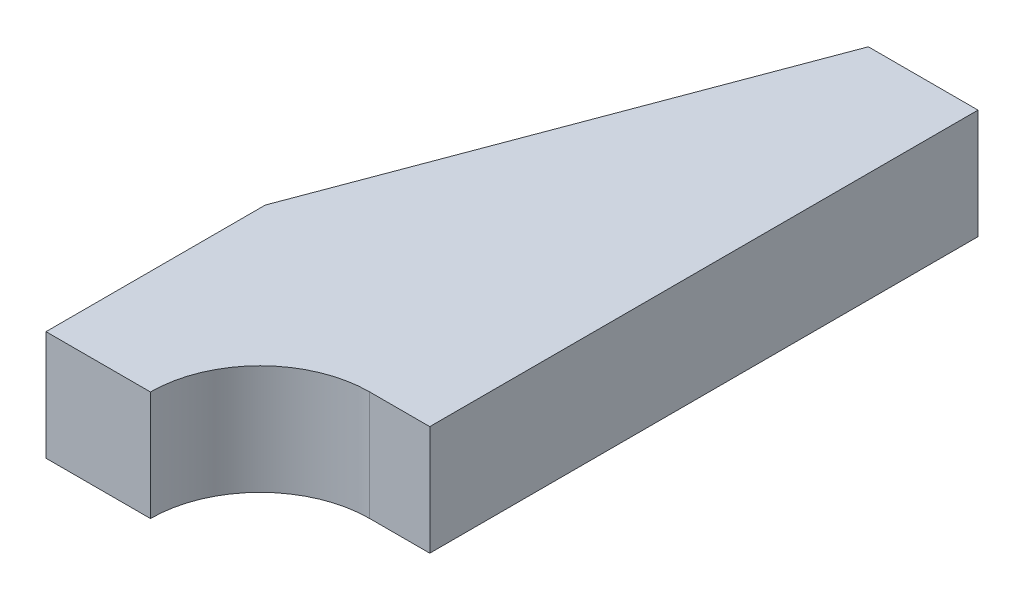
ISO-10303-21;
HEADER;
FILE_DESCRIPTION(('STEP AP214'),'2;1');
FILE_NAME('part.step','',(''),(''),'','','');
FILE_SCHEMA(('AUTOMOTIVE_DESIGN { 1 0 10303 214 1 1 1 1 }'));
ENDSEC;
DATA;
#1=APPLICATION_CONTEXT('core data for automotive mechanical design processes');
#2=APPLICATION_PROTOCOL_DEFINITION('international standard','automotive_design',2000,#1);
#3=PRODUCT_CONTEXT('',#1,'mechanical');
#4=PRODUCT('Part','Part','',(#3));
#5=PRODUCT_RELATED_PRODUCT_CATEGORY('part','',(#4));
#6=PRODUCT_DEFINITION_FORMATION('','',#4);
#7=PRODUCT_DEFINITION_CONTEXT('part definition',#1,'design');
#8=PRODUCT_DEFINITION('design','',#6,#7);
#9=PRODUCT_DEFINITION_SHAPE('','',#8);
#10=(LENGTH_UNIT() NAMED_UNIT(*) SI_UNIT(.MILLI.,.METRE.));
#11=(NAMED_UNIT(*) PLANE_ANGLE_UNIT() SI_UNIT($,.RADIAN.));
#12=(NAMED_UNIT(*) SI_UNIT($,.STERADIAN.) SOLID_ANGLE_UNIT());
#13=UNCERTAINTY_MEASURE_WITH_UNIT(LENGTH_MEASURE(1.E-05),#10,'distance_accuracy_value','');
#14=(GEOMETRIC_REPRESENTATION_CONTEXT(3) GLOBAL_UNCERTAINTY_ASSIGNED_CONTEXT((#13)) GLOBAL_UNIT_ASSIGNED_CONTEXT((#10,
#11,#12)) REPRESENTATION_CONTEXT('',''));
#15=CARTESIAN_POINT('',(0.,0.,0.));
#16=DIRECTION('',(0.,0.,1.));
#17=DIRECTION('',(1.,0.,0.));
#18=AXIS2_PLACEMENT_3D('',#15,#16,#17);
#19=CARTESIAN_POINT('',(12.5,10.,-40.));
#20=DIRECTION('',(0.,0.,1.));
#21=DIRECTION('',(1.,0.,0.));
#22=AXIS2_PLACEMENT_3D('',#19,#20,#21);
#23=PLANE('',#22);
#24=DIRECTION('',(-1.,0.,0.));
#25=VECTOR('',#24,1.);
#26=CARTESIAN_POINT('',(12.5,0.,-40.));
#27=LINE('',#26,#25);
#28=CARTESIAN_POINT('',(12.5,0.,-40.));
#29=VERTEX_POINT('',#28);
#30=CARTESIAN_POINT('',(2.49999999999999,0.,-40.));
#31=VERTEX_POINT('',#30);
#32=EDGE_CURVE('E129',#29,#31,#27,.T.);
#33=ORIENTED_EDGE('',*,*,#32,.T.);
#34=DIRECTION('',(0.,-1.,0.));
#35=VECTOR('',#34,1.);
#36=CARTESIAN_POINT('',(2.49999999999999,10.,-40.));
#37=LINE('',#36,#35);
#38=CARTESIAN_POINT('',(2.49999999999999,10.,-40.));
#39=VERTEX_POINT('',#38);
#40=EDGE_CURVE('E11',#39,#31,#37,.T.);
#41=ORIENTED_EDGE('',*,*,#40,.F.);
#42=DIRECTION('',(-1.,0.,0.));
#43=VECTOR('',#42,1.);
#44=CARTESIAN_POINT('',(12.5,10.,-40.));
#45=LINE('',#44,#43);
#46=CARTESIAN_POINT('',(12.5,10.,-40.));
#47=VERTEX_POINT('',#46);
#48=EDGE_CURVE('E141',#47,#39,#45,.T.);
#49=ORIENTED_EDGE('',*,*,#48,.F.);
#50=DIRECTION('',(0.,-1.,0.));
#51=VECTOR('',#50,1.);
#52=CARTESIAN_POINT('',(12.5,10.,-40.));
#53=LINE('',#52,#51);
#54=EDGE_CURVE('E125',#47,#29,#53,.T.);
#55=ORIENTED_EDGE('',*,*,#54,.T.);
#56=EDGE_LOOP('',(#33,#41,#49,#55));
#57=FACE_BOUND('',#56,.T.);
#58=ADVANCED_FACE('F39',(#57),#23,.F.);
#59=CARTESIAN_POINT('',(2.49999999999999,10.,-40.));
#60=DIRECTION('',(0.936329177569045,0.,0.351123441588392));
#61=DIRECTION('',(0.351123441588392,0.,-0.936329177569045));
#62=AXIS2_PLACEMENT_3D('',#59,#60,#61);
#63=PLANE('',#62);
#64=DIRECTION('',(-0.351123441588392,0.,0.936329177569045));
#65=VECTOR('',#64,1.);
#66=CARTESIAN_POINT('',(2.49999999999999,0.,-40.));
#67=LINE('',#66,#65);
#68=CARTESIAN_POINT('',(-12.5,0.,0.));
#69=VERTEX_POINT('',#68);
#70=EDGE_CURVE('E132',#31,#69,#67,.T.);
#71=ORIENTED_EDGE('',*,*,#70,.T.);
#72=DIRECTION('',(0.,-1.,0.));
#73=VECTOR('',#72,1.);
#74=CARTESIAN_POINT('',(-12.5,10.,0.));
#75=LINE('',#74,#73);
#76=CARTESIAN_POINT('',(-12.5,10.,0.));
#77=VERTEX_POINT('',#76);
#78=EDGE_CURVE('E47',#77,#69,#75,.T.);
#79=ORIENTED_EDGE('',*,*,#78,.F.);
#80=DIRECTION('',(-0.351123441588392,0.,0.936329177569045));
#81=VECTOR('',#80,1.);
#82=CARTESIAN_POINT('',(2.49999999999999,10.,-40.));
#83=LINE('',#82,#81);
#84=EDGE_CURVE('E95',#39,#77,#83,.T.);
#85=ORIENTED_EDGE('',*,*,#84,.F.);
#86=ORIENTED_EDGE('',*,*,#40,.T.);
#87=EDGE_LOOP('',(#71,#79,#85,#86));
#88=FACE_BOUND('',#87,.T.);
#89=ADVANCED_FACE('F166',(#88),#63,.F.);
#90=CARTESIAN_POINT('',(-12.5,10.,0.));
#91=DIRECTION('',(1.,0.,0.));
#92=DIRECTION('',(0.,0.,-1.));
#93=AXIS2_PLACEMENT_3D('',#90,#91,#92);
#94=PLANE('',#93);
#95=DIRECTION('',(0.,0.,1.));
#96=VECTOR('',#95,1.);
#97=CARTESIAN_POINT('',(-12.5,0.,0.));
#98=LINE('',#97,#96);
#99=CARTESIAN_POINT('',(-12.5,0.,20.));
#100=VERTEX_POINT('',#99);
#101=EDGE_CURVE('E134',#69,#100,#98,.T.);
#102=ORIENTED_EDGE('',*,*,#101,.T.);
#103=DIRECTION('',(0.,-1.,0.));
#104=VECTOR('',#103,1.);
#105=CARTESIAN_POINT('',(-12.5,10.,20.));
#106=LINE('',#105,#104);
#107=CARTESIAN_POINT('',(-12.5,10.,20.));
#108=VERTEX_POINT('',#107);
#109=EDGE_CURVE('E145',#108,#100,#106,.T.);
#110=ORIENTED_EDGE('',*,*,#109,.F.);
#111=DIRECTION('',(0.,0.,1.));
#112=VECTOR('',#111,1.);
#113=CARTESIAN_POINT('',(-12.5,10.,0.));
#114=LINE('',#113,#112);
#115=EDGE_CURVE('E153',#77,#108,#114,.T.);
#116=ORIENTED_EDGE('',*,*,#115,.F.);
#117=ORIENTED_EDGE('',*,*,#78,.T.);
#118=EDGE_LOOP('',(#102,#110,#116,#117));
#119=FACE_BOUND('',#118,.T.);
#120=ADVANCED_FACE('F151',(#119),#94,.F.);
#121=CARTESIAN_POINT('',(-2.975,10.,20.));
#122=DIRECTION('',(0.,0.,-1.));
#123=DIRECTION('',(-1.,0.,0.));
#124=AXIS2_PLACEMENT_3D('',#121,#122,#123);
#125=PLANE('',#124);
#126=DIRECTION('',(1.,0.,0.));
#127=VECTOR('',#126,1.);
#128=CARTESIAN_POINT('',(-2.975,0.,20.));
#129=LINE('',#128,#127);
#130=CARTESIAN_POINT('',(-2.975,0.,20.));
#131=VERTEX_POINT('',#130);
#132=EDGE_CURVE('E136',#100,#131,#129,.T.);
#133=ORIENTED_EDGE('',*,*,#132,.T.);
#134=DIRECTION('',(0.,-1.,0.));
#135=VECTOR('',#134,1.);
#136=CARTESIAN_POINT('',(-2.975,10.,20.));
#137=LINE('',#136,#135);
#138=CARTESIAN_POINT('',(-2.975,10.,20.));
#139=VERTEX_POINT('',#138);
#140=EDGE_CURVE('E120',#139,#131,#137,.T.);
#141=ORIENTED_EDGE('',*,*,#140,.F.);
#142=DIRECTION('',(1.,0.,0.));
#143=VECTOR('',#142,1.);
#144=CARTESIAN_POINT('',(-2.975,10.,20.));
#145=LINE('',#144,#143);
#146=EDGE_CURVE('E111',#108,#139,#145,.T.);
#147=ORIENTED_EDGE('',*,*,#146,.F.);
#148=ORIENTED_EDGE('',*,*,#109,.T.);
#149=EDGE_LOOP('',(#133,#141,#147,#148));
#150=FACE_BOUND('',#149,.T.);
#151=ADVANCED_FACE('F159',(#150),#125,.F.);
#152=CARTESIAN_POINT('',(7.025,10.,20.));
#153=DIRECTION('',(0.,-1.,0.));
#154=DIRECTION('',(0.,0.,-1.));
#155=AXIS2_PLACEMENT_3D('',#152,#153,#154);
#156=CYLINDRICAL_SURFACE('',#155,10.);
#157=CARTESIAN_POINT('',(7.025,0.,20.));
#158=DIRECTION('',(0.,-1.,0.));
#159=DIRECTION('',(0.,0.,-1.));
#160=AXIS2_PLACEMENT_3D('',#157,#158,#159);
#161=CIRCLE('',#160,10.);
#162=CARTESIAN_POINT('',(7.025,0.,10.));
#163=VERTEX_POINT('',#162);
#164=EDGE_CURVE('E119',#131,#163,#161,.T.);
#165=ORIENTED_EDGE('',*,*,#164,.T.);
#166=DIRECTION('',(0.,-1.,0.));
#167=VECTOR('',#166,1.);
#168=CARTESIAN_POINT('',(7.025,10.,10.));
#169=LINE('',#168,#167);
#170=CARTESIAN_POINT('',(7.025,10.,10.));
#171=VERTEX_POINT('',#170);
#172=EDGE_CURVE('E116',#171,#163,#169,.T.);
#173=ORIENTED_EDGE('',*,*,#172,.F.);
#174=CARTESIAN_POINT('',(7.025,10.,20.));
#175=DIRECTION('',(0.,-1.,0.));
#176=DIRECTION('',(0.,0.,-1.));
#177=AXIS2_PLACEMENT_3D('',#174,#175,#176);
#178=CIRCLE('',#177,10.);
#179=EDGE_CURVE('E105',#139,#171,#178,.T.);
#180=ORIENTED_EDGE('',*,*,#179,.F.);
#181=ORIENTED_EDGE('',*,*,#140,.T.);
#182=EDGE_LOOP('',(#165,#173,#180,#181));
#183=FACE_BOUND('',#182,.T.);
#184=ADVANCED_FACE('F117',(#183),#156,.F.);
#185=CARTESIAN_POINT('',(7.025,10.,10.));
#186=DIRECTION('',(0.,0.,-1.));
#187=DIRECTION('',(-1.,0.,0.));
#188=AXIS2_PLACEMENT_3D('',#185,#186,#187);
#189=PLANE('',#188);
#190=DIRECTION('',(1.,0.,0.));
#191=VECTOR('',#190,1.);
#192=CARTESIAN_POINT('',(7.025,0.,10.));
#193=LINE('',#192,#191);
#194=CARTESIAN_POINT('',(12.5,0.,10.));
#195=VERTEX_POINT('',#194);
#196=EDGE_CURVE('E81',#163,#195,#193,.T.);
#197=ORIENTED_EDGE('',*,*,#196,.T.);
#198=DIRECTION('',(0.,-1.,0.));
#199=VECTOR('',#198,1.);
#200=CARTESIAN_POINT('',(12.5,10.,10.));
#201=LINE('',#200,#199);
#202=CARTESIAN_POINT('',(12.5,10.,10.));
#203=VERTEX_POINT('',#202);
#204=EDGE_CURVE('E121',#203,#195,#201,.T.);
#205=ORIENTED_EDGE('',*,*,#204,.F.);
#206=DIRECTION('',(1.,0.,0.));
#207=VECTOR('',#206,1.);
#208=CARTESIAN_POINT('',(7.025,10.,10.));
#209=LINE('',#208,#207);
#210=EDGE_CURVE('E109',#171,#203,#209,.T.);
#211=ORIENTED_EDGE('',*,*,#210,.F.);
#212=ORIENTED_EDGE('',*,*,#172,.T.);
#213=EDGE_LOOP('',(#197,#205,#211,#212));
#214=FACE_BOUND('',#213,.T.);
#215=ADVANCED_FACE('F123',(#214),#189,.F.);
#216=CARTESIAN_POINT('',(12.5,10.,10.));
#217=DIRECTION('',(-1.,0.,0.));
#218=DIRECTION('',(0.,0.,1.));
#219=AXIS2_PLACEMENT_3D('',#216,#217,#218);
#220=PLANE('',#219);
#221=DIRECTION('',(0.,0.,-1.));
#222=VECTOR('',#221,1.);
#223=CARTESIAN_POINT('',(12.5,0.,10.));
#224=LINE('',#223,#222);
#225=EDGE_CURVE('E87',#195,#29,#224,.T.);
#226=ORIENTED_EDGE('',*,*,#225,.T.);
#227=ORIENTED_EDGE('',*,*,#54,.F.);
#228=DIRECTION('',(0.,0.,-1.));
#229=VECTOR('',#228,1.);
#230=CARTESIAN_POINT('',(12.5,10.,10.));
#231=LINE('',#230,#229);
#232=EDGE_CURVE('E55',#203,#47,#231,.T.);
#233=ORIENTED_EDGE('',*,*,#232,.F.);
#234=ORIENTED_EDGE('',*,*,#204,.T.);
#235=EDGE_LOOP('',(#226,#227,#233,#234));
#236=FACE_BOUND('',#235,.T.);
#237=ADVANCED_FACE('F180',(#236),#220,.F.);
#238=CARTESIAN_POINT('',(7.025,10.,20.));
#239=DIRECTION('',(0.,-1.,0.));
#240=DIRECTION('',(0.,0.,-1.));
#241=AXIS2_PLACEMENT_3D('',#238,#239,#240);
#242=PLANE('',#241);
#243=ORIENTED_EDGE('',*,*,#48,.T.);
#244=ORIENTED_EDGE('',*,*,#84,.T.);
#245=ORIENTED_EDGE('',*,*,#115,.T.);
#246=ORIENTED_EDGE('',*,*,#146,.T.);
#247=ORIENTED_EDGE('',*,*,#179,.T.);
#248=ORIENTED_EDGE('',*,*,#210,.T.);
#249=ORIENTED_EDGE('',*,*,#232,.T.);
#250=EDGE_LOOP('',(#243,#244,#245,#246,#247,#248,#249));
#251=FACE_BOUND('',#250,.T.);
#252=ADVANCED_FACE('F107',(#251),#242,.F.);
#253=CARTESIAN_POINT('',(7.025,0.,20.));
#254=DIRECTION('',(0.,-1.,0.));
#255=DIRECTION('',(0.,0.,-1.));
#256=AXIS2_PLACEMENT_3D('',#253,#254,#255);
#257=PLANE('',#256);
#258=ORIENTED_EDGE('',*,*,#32,.F.);
#259=ORIENTED_EDGE('',*,*,#225,.F.);
#260=ORIENTED_EDGE('',*,*,#196,.F.);
#261=ORIENTED_EDGE('',*,*,#164,.F.);
#262=ORIENTED_EDGE('',*,*,#132,.F.);
#263=ORIENTED_EDGE('',*,*,#101,.F.);
#264=ORIENTED_EDGE('',*,*,#70,.F.);
#265=EDGE_LOOP('',(#258,#259,#260,#261,#262,#263,#264));
#266=FACE_BOUND('',#265,.T.);
#267=ADVANCED_FACE('F157',(#266),#257,.T.);
#268=CLOSED_SHELL('',(#58,#89,#120,#151,#184,#215,#237,#252,#267));
#269=MANIFOLD_SOLID_BREP('B2',#268);
#270=ADVANCED_BREP_SHAPE_REPRESENTATION('',(#18,#269),#14);
#271=SHAPE_DEFINITION_REPRESENTATION(#9,#270);
ENDSEC;
END-ISO-10303-21;
